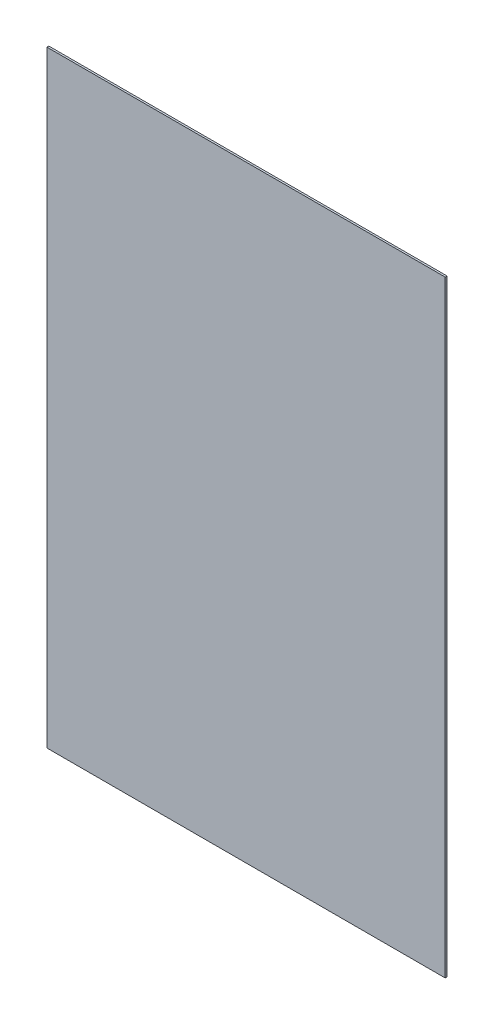
ISO-10303-21;
HEADER;
FILE_DESCRIPTION(('STEP AP214'),'2;1');
FILE_NAME('part.step','',(''),(''),'','','');
FILE_SCHEMA(('AUTOMOTIVE_DESIGN { 1 0 10303 214 1 1 1 1 }'));
ENDSEC;
DATA;
#1=APPLICATION_CONTEXT('core data for automotive mechanical design processes');
#2=APPLICATION_PROTOCOL_DEFINITION('international standard','automotive_design',2000,#1);
#3=PRODUCT_CONTEXT('',#1,'mechanical');
#4=PRODUCT('Part','Part','',(#3));
#5=PRODUCT_RELATED_PRODUCT_CATEGORY('part','',(#4));
#6=PRODUCT_DEFINITION_FORMATION('','',#4);
#7=PRODUCT_DEFINITION_CONTEXT('part definition',#1,'design');
#8=PRODUCT_DEFINITION('design','',#6,#7);
#9=PRODUCT_DEFINITION_SHAPE('','',#8);
#10=(LENGTH_UNIT() NAMED_UNIT(*) SI_UNIT(.MILLI.,.METRE.));
#11=(NAMED_UNIT(*) PLANE_ANGLE_UNIT() SI_UNIT($,.RADIAN.));
#12=(NAMED_UNIT(*) SI_UNIT($,.STERADIAN.) SOLID_ANGLE_UNIT());
#13=UNCERTAINTY_MEASURE_WITH_UNIT(LENGTH_MEASURE(1.E-05),#10,'distance_accuracy_value','');
#14=(GEOMETRIC_REPRESENTATION_CONTEXT(3) GLOBAL_UNCERTAINTY_ASSIGNED_CONTEXT((#13)) GLOBAL_UNIT_ASSIGNED_CONTEXT((#10,
#11,#12)) REPRESENTATION_CONTEXT('',''));
#15=CARTESIAN_POINT('',(0.,0.,0.));
#16=DIRECTION('',(0.,0.,1.));
#17=DIRECTION('',(1.,0.,0.));
#18=AXIS2_PLACEMENT_3D('',#15,#16,#17);
#19=CARTESIAN_POINT('',(0.,0.,1.));
#20=DIRECTION('',(-1.,0.,0.));
#21=DIRECTION('',(0.,0.,1.));
#22=AXIS2_PLACEMENT_3D('',#19,#20,#21);
#23=PLANE('',#22);
#24=DIRECTION('',(0.,1.,0.));
#25=VECTOR('',#24,1.);
#26=CARTESIAN_POINT('',(0.,0.,0.));
#27=LINE('',#26,#25);
#28=CARTESIAN_POINT('',(0.,0.,0.));
#29=VERTEX_POINT('',#28);
#30=CARTESIAN_POINT('',(0.,320.,0.));
#31=VERTEX_POINT('',#30);
#32=EDGE_CURVE('E98',#29,#31,#27,.T.);
#33=ORIENTED_EDGE('',*,*,#32,.T.);
#34=DIRECTION('',(0.,0.,-1.));
#35=VECTOR('',#34,1.);
#36=CARTESIAN_POINT('',(0.,320.,1.));
#37=LINE('',#36,#35);
#38=CARTESIAN_POINT('',(0.,320.,1.));
#39=VERTEX_POINT('',#38);
#40=EDGE_CURVE('E11',#39,#31,#37,.T.);
#41=ORIENTED_EDGE('',*,*,#40,.F.);
#42=DIRECTION('',(0.,1.,0.));
#43=VECTOR('',#42,1.);
#44=CARTESIAN_POINT('',(0.,0.,1.));
#45=LINE('',#44,#43);
#46=CARTESIAN_POINT('',(0.,0.,1.));
#47=VERTEX_POINT('',#46);
#48=EDGE_CURVE('E86',#47,#39,#45,.T.);
#49=ORIENTED_EDGE('',*,*,#48,.F.);
#50=DIRECTION('',(0.,0.,-1.));
#51=VECTOR('',#50,1.);
#52=CARTESIAN_POINT('',(0.,0.,1.));
#53=LINE('',#52,#51);
#54=EDGE_CURVE('E94',#47,#29,#53,.T.);
#55=ORIENTED_EDGE('',*,*,#54,.T.);
#56=EDGE_LOOP('',(#33,#41,#49,#55));
#57=FACE_BOUND('',#56,.T.);
#58=ADVANCED_FACE('F35',(#57),#23,.F.);
#59=CARTESIAN_POINT('',(0.,320.,1.));
#60=DIRECTION('',(0.,-1.,0.));
#61=DIRECTION('',(0.,0.,-1.));
#62=AXIS2_PLACEMENT_3D('',#59,#60,#61);
#63=PLANE('',#62);
#64=DIRECTION('',(-1.,0.,0.));
#65=VECTOR('',#64,1.);
#66=CARTESIAN_POINT('',(0.,320.,0.));
#67=LINE('',#66,#65);
#68=CARTESIAN_POINT('',(-210.,320.,0.));
#69=VERTEX_POINT('',#68);
#70=EDGE_CURVE('E90',#31,#69,#67,.T.);
#71=ORIENTED_EDGE('',*,*,#70,.T.);
#72=DIRECTION('',(0.,0.,-1.));
#73=VECTOR('',#72,1.);
#74=CARTESIAN_POINT('',(-210.,320.,1.));
#75=LINE('',#74,#73);
#76=CARTESIAN_POINT('',(-210.,320.,1.));
#77=VERTEX_POINT('',#76);
#78=EDGE_CURVE('E43',#77,#69,#75,.T.);
#79=ORIENTED_EDGE('',*,*,#78,.F.);
#80=DIRECTION('',(-1.,0.,0.));
#81=VECTOR('',#80,1.);
#82=CARTESIAN_POINT('',(0.,320.,1.));
#83=LINE('',#82,#81);
#84=EDGE_CURVE('E81',#39,#77,#83,.T.);
#85=ORIENTED_EDGE('',*,*,#84,.F.);
#86=ORIENTED_EDGE('',*,*,#40,.T.);
#87=EDGE_LOOP('',(#71,#79,#85,#86));
#88=FACE_BOUND('',#87,.T.);
#89=ADVANCED_FACE('F89',(#88),#63,.F.);
#90=CARTESIAN_POINT('',(-210.,0.,1.));
#91=DIRECTION('',(1.,0.,0.));
#92=DIRECTION('',(0.,1.,0.));
#93=AXIS2_PLACEMENT_3D('',#90,#91,#92);
#94=PLANE('',#93);
#95=DIRECTION('',(0.,-1.,0.));
#96=VECTOR('',#95,1.);
#97=CARTESIAN_POINT('',(-210.,0.,0.));
#98=LINE('',#97,#96);
#99=CARTESIAN_POINT('',(-210.,0.,0.));
#100=VERTEX_POINT('',#99);
#101=EDGE_CURVE('E68',#69,#100,#98,.T.);
#102=ORIENTED_EDGE('',*,*,#101,.T.);
#103=DIRECTION('',(0.,0.,-1.));
#104=VECTOR('',#103,1.);
#105=CARTESIAN_POINT('',(-210.,0.,1.));
#106=LINE('',#105,#104);
#107=CARTESIAN_POINT('',(-210.,0.,1.));
#108=VERTEX_POINT('',#107);
#109=EDGE_CURVE('E91',#108,#100,#106,.T.);
#110=ORIENTED_EDGE('',*,*,#109,.F.);
#111=DIRECTION('',(0.,-1.,0.));
#112=VECTOR('',#111,1.);
#113=CARTESIAN_POINT('',(-210.,0.,1.));
#114=LINE('',#113,#112);
#115=EDGE_CURVE('E84',#77,#108,#114,.T.);
#116=ORIENTED_EDGE('',*,*,#115,.F.);
#117=ORIENTED_EDGE('',*,*,#78,.T.);
#118=EDGE_LOOP('',(#102,#110,#116,#117));
#119=FACE_BOUND('',#118,.T.);
#120=ADVANCED_FACE('F92',(#119),#94,.F.);
#121=CARTESIAN_POINT('',(0.,0.,1.));
#122=DIRECTION('',(0.,1.,0.));
#123=DIRECTION('',(-1.,0.,0.));
#124=AXIS2_PLACEMENT_3D('',#121,#122,#123);
#125=PLANE('',#124);
#126=DIRECTION('',(1.,0.,0.));
#127=VECTOR('',#126,1.);
#128=CARTESIAN_POINT('',(0.,0.,0.));
#129=LINE('',#128,#127);
#130=EDGE_CURVE('E74',#100,#29,#129,.T.);
#131=ORIENTED_EDGE('',*,*,#130,.T.);
#132=ORIENTED_EDGE('',*,*,#54,.F.);
#133=DIRECTION('',(1.,0.,0.));
#134=VECTOR('',#133,1.);
#135=CARTESIAN_POINT('',(0.,0.,1.));
#136=LINE('',#135,#134);
#137=EDGE_CURVE('E51',#108,#47,#136,.T.);
#138=ORIENTED_EDGE('',*,*,#137,.F.);
#139=ORIENTED_EDGE('',*,*,#109,.T.);
#140=EDGE_LOOP('',(#131,#132,#138,#139));
#141=FACE_BOUND('',#140,.T.);
#142=ADVANCED_FACE('F105',(#141),#125,.F.);
#143=CARTESIAN_POINT('',(0.,0.,1.));
#144=DIRECTION('',(0.,0.,1.));
#145=DIRECTION('',(1.,0.,0.));
#146=AXIS2_PLACEMENT_3D('',#143,#144,#145);
#147=PLANE('',#146);
#148=ORIENTED_EDGE('',*,*,#48,.T.);
#149=ORIENTED_EDGE('',*,*,#84,.T.);
#150=ORIENTED_EDGE('',*,*,#115,.T.);
#151=ORIENTED_EDGE('',*,*,#137,.T.);
#152=EDGE_LOOP('',(#148,#149,#150,#151));
#153=FACE_BOUND('',#152,.T.);
#154=ADVANCED_FACE('F82',(#153),#147,.T.);
#155=CARTESIAN_POINT('',(0.,0.,0.));
#156=DIRECTION('',(0.,0.,1.));
#157=DIRECTION('',(1.,0.,0.));
#158=AXIS2_PLACEMENT_3D('',#155,#156,#157);
#159=PLANE('',#158);
#160=ORIENTED_EDGE('',*,*,#32,.F.);
#161=ORIENTED_EDGE('',*,*,#130,.F.);
#162=ORIENTED_EDGE('',*,*,#101,.F.);
#163=ORIENTED_EDGE('',*,*,#70,.F.);
#164=EDGE_LOOP('',(#160,#161,#162,#163));
#165=FACE_BOUND('',#164,.T.);
#166=ADVANCED_FACE('F108',(#165),#159,.F.);
#167=CLOSED_SHELL('',(#58,#89,#120,#142,#154,#166));
#168=MANIFOLD_SOLID_BREP('B2',#167);
#169=ADVANCED_BREP_SHAPE_REPRESENTATION('',(#18,#168),#14);
#170=SHAPE_DEFINITION_REPRESENTATION(#9,#169);
ENDSEC;
END-ISO-10303-21;
